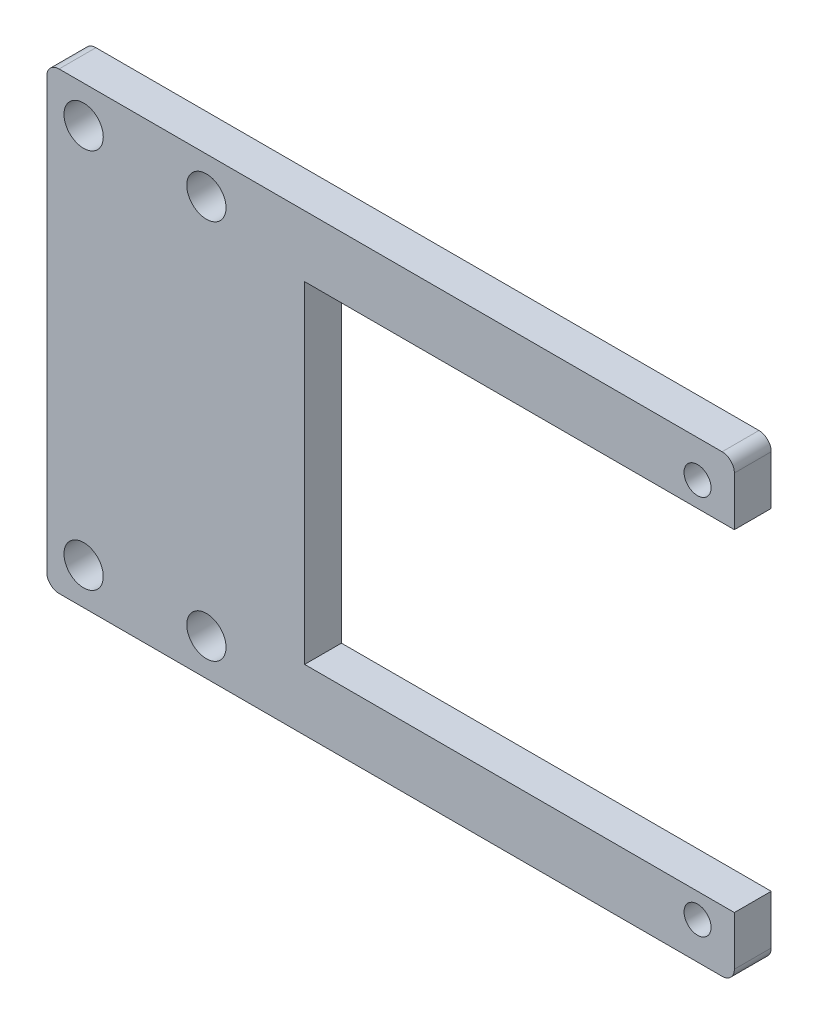
ISO-10303-21;
HEADER;
FILE_DESCRIPTION(('STEP AP214'),'2;1');
FILE_NAME('part.step','',(''),(''),'','','');
FILE_SCHEMA(('AUTOMOTIVE_DESIGN { 1 0 10303 214 1 1 1 1 }'));
ENDSEC;
DATA;
#1=APPLICATION_CONTEXT('core data for automotive mechanical design processes');
#2=APPLICATION_PROTOCOL_DEFINITION('international standard','automotive_design',2000,#1);
#3=PRODUCT_CONTEXT('',#1,'mechanical');
#4=PRODUCT('Part','Part','',(#3));
#5=PRODUCT_RELATED_PRODUCT_CATEGORY('part','',(#4));
#6=PRODUCT_DEFINITION_FORMATION('','',#4);
#7=PRODUCT_DEFINITION_CONTEXT('part definition',#1,'design');
#8=PRODUCT_DEFINITION('design','',#6,#7);
#9=PRODUCT_DEFINITION_SHAPE('','',#8);
#10=(LENGTH_UNIT() NAMED_UNIT(*) SI_UNIT(.MILLI.,.METRE.));
#11=(NAMED_UNIT(*) PLANE_ANGLE_UNIT() SI_UNIT($,.RADIAN.));
#12=(NAMED_UNIT(*) SI_UNIT($,.STERADIAN.) SOLID_ANGLE_UNIT());
#13=UNCERTAINTY_MEASURE_WITH_UNIT(LENGTH_MEASURE(1.E-05),#10,'distance_accuracy_value','');
#14=(GEOMETRIC_REPRESENTATION_CONTEXT(3) GLOBAL_UNCERTAINTY_ASSIGNED_CONTEXT((#13)) GLOBAL_UNIT_ASSIGNED_CONTEXT((#10,
#11,#12)) REPRESENTATION_CONTEXT('',''));
#15=CARTESIAN_POINT('',(0.,0.,0.));
#16=DIRECTION('',(0.,0.,1.));
#17=DIRECTION('',(1.,0.,0.));
#18=AXIS2_PLACEMENT_3D('',#15,#16,#17);
#19=CARTESIAN_POINT('',(0.,0.,3.));
#20=DIRECTION('',(0.,0.,-1.));
#21=DIRECTION('',(-1.,0.,0.));
#22=AXIS2_PLACEMENT_3D('',#19,#20,#21);
#23=PLANE('',#22);
#24=DIRECTION('',(0.,-1.,0.));
#25=VECTOR('',#24,1.);
#26=CARTESIAN_POINT('',(-28.,-18.5,3.));
#27=LINE('',#26,#25);
#28=CARTESIAN_POINT('',(-28.,17.5,3.));
#29=VERTEX_POINT('',#28);
#30=CARTESIAN_POINT('',(-28.,-17.5,3.));
#31=VERTEX_POINT('',#30);
#32=EDGE_CURVE('E237',#29,#31,#27,.T.);
#33=ORIENTED_EDGE('',*,*,#32,.T.);
#34=CARTESIAN_POINT('',(-27.,-17.5,3.));
#35=DIRECTION('',(0.,0.,-1.));
#36=DIRECTION('',(-1.,0.,0.));
#37=AXIS2_PLACEMENT_3D('',#34,#35,#36);
#38=CIRCLE('',#37,1.);
#39=CARTESIAN_POINT('',(-27.,-18.5,3.));
#40=VERTEX_POINT('',#39);
#41=EDGE_CURVE('E209',#31,#40,#38,.F.);
#42=ORIENTED_EDGE('',*,*,#41,.T.);
#43=DIRECTION('',(1.,0.,0.));
#44=VECTOR('',#43,1.);
#45=CARTESIAN_POINT('',(-28.,-18.5,3.));
#46=LINE('',#45,#44);
#47=CARTESIAN_POINT('',(27.,-18.5,3.));
#48=VERTEX_POINT('',#47);
#49=EDGE_CURVE('E136',#40,#48,#46,.T.);
#50=ORIENTED_EDGE('',*,*,#49,.T.);
#51=CARTESIAN_POINT('',(27.,-17.5,3.));
#52=DIRECTION('',(0.,0.,-1.));
#53=DIRECTION('',(-1.,0.,0.));
#54=AXIS2_PLACEMENT_3D('',#51,#52,#53);
#55=CIRCLE('',#54,1.);
#56=CARTESIAN_POINT('',(28.,-17.5,3.));
#57=VERTEX_POINT('',#56);
#58=EDGE_CURVE('E60',#48,#57,#55,.F.);
#59=ORIENTED_EDGE('',*,*,#58,.T.);
#60=DIRECTION('',(0.,1.,0.));
#61=VECTOR('',#60,1.);
#62=CARTESIAN_POINT('',(28.,-13.5,3.));
#63=LINE('',#62,#61);
#64=CARTESIAN_POINT('',(28.,-13.5,3.));
#65=VERTEX_POINT('',#64);
#66=EDGE_CURVE('E126',#57,#65,#63,.T.);
#67=ORIENTED_EDGE('',*,*,#66,.T.);
#68=DIRECTION('',(-1.,0.,0.));
#69=VECTOR('',#68,1.);
#70=CARTESIAN_POINT('',(-7.,-13.5,3.));
#71=LINE('',#70,#69);
#72=CARTESIAN_POINT('',(-7.,-13.5,3.));
#73=VERTEX_POINT('',#72);
#74=EDGE_CURVE('E131',#65,#73,#71,.T.);
#75=ORIENTED_EDGE('',*,*,#74,.T.);
#76=DIRECTION('',(0.,1.,0.));
#77=VECTOR('',#76,1.);
#78=CARTESIAN_POINT('',(-7.,13.5,3.));
#79=LINE('',#78,#77);
#80=CARTESIAN_POINT('',(-7.,13.5,3.));
#81=VERTEX_POINT('',#80);
#82=EDGE_CURVE('E151',#73,#81,#79,.T.);
#83=ORIENTED_EDGE('',*,*,#82,.T.);
#84=DIRECTION('',(1.,0.,0.));
#85=VECTOR('',#84,1.);
#86=CARTESIAN_POINT('',(28.,13.5,3.));
#87=LINE('',#86,#85);
#88=CARTESIAN_POINT('',(28.,13.5,3.));
#89=VERTEX_POINT('',#88);
#90=EDGE_CURVE('E153',#81,#89,#87,.T.);
#91=ORIENTED_EDGE('',*,*,#90,.T.);
#92=DIRECTION('',(0.,1.,0.));
#93=VECTOR('',#92,1.);
#94=CARTESIAN_POINT('',(28.,18.5,3.));
#95=LINE('',#94,#93);
#96=CARTESIAN_POINT('',(28.,17.5,3.));
#97=VERTEX_POINT('',#96);
#98=EDGE_CURVE('E158',#89,#97,#95,.T.);
#99=ORIENTED_EDGE('',*,*,#98,.T.);
#100=CARTESIAN_POINT('',(27.,17.5,3.));
#101=DIRECTION('',(0.,0.,-1.));
#102=DIRECTION('',(-1.,0.,0.));
#103=AXIS2_PLACEMENT_3D('',#100,#101,#102);
#104=CIRCLE('',#103,1.);
#105=CARTESIAN_POINT('',(27.,18.5,3.));
#106=VERTEX_POINT('',#105);
#107=EDGE_CURVE('E206',#97,#106,#104,.F.);
#108=ORIENTED_EDGE('',*,*,#107,.T.);
#109=DIRECTION('',(-1.,0.,0.));
#110=VECTOR('',#109,1.);
#111=CARTESIAN_POINT('',(-28.,18.5,3.));
#112=LINE('',#111,#110);
#113=CARTESIAN_POINT('',(-27.,18.5,3.));
#114=VERTEX_POINT('',#113);
#115=EDGE_CURVE('E180',#106,#114,#112,.T.);
#116=ORIENTED_EDGE('',*,*,#115,.T.);
#117=CARTESIAN_POINT('',(-27.,17.5,3.));
#118=DIRECTION('',(0.,0.,-1.));
#119=DIRECTION('',(-1.,0.,0.));
#120=AXIS2_PLACEMENT_3D('',#117,#118,#119);
#121=CIRCLE('',#120,1.);
#122=EDGE_CURVE('E204',#114,#29,#121,.F.);
#123=ORIENTED_EDGE('',*,*,#122,.T.);
#124=EDGE_LOOP('',(#33,#42,#50,#59,#67,#75,#83,#91,#99,#108,#116,#123));
#125=FACE_BOUND('',#124,.T.);
#126=CARTESIAN_POINT('',(25.,15.5,3.));
#127=DIRECTION('',(0.,0.,1.));
#128=DIRECTION('',(1.,0.,0.));
#129=AXIS2_PLACEMENT_3D('',#126,#127,#128);
#130=CIRCLE('',#129,1.1);
#131=CARTESIAN_POINT('',(26.1,15.5,3.));
#132=VERTEX_POINT('',#131);
#133=EDGE_CURVE('E165',#132,#132,#130,.T.);
#134=ORIENTED_EDGE('',*,*,#133,.F.);
#135=EDGE_LOOP('',(#134));
#136=FACE_BOUND('',#135,.T.);
#137=CARTESIAN_POINT('',(24.9999999999999,-15.5,3.));
#138=DIRECTION('',(0.,0.,1.));
#139=DIRECTION('',(-1.,0.,0.));
#140=AXIS2_PLACEMENT_3D('',#137,#138,#139);
#141=CIRCLE('',#140,1.1);
#142=CARTESIAN_POINT('',(23.8999999999999,-15.5,3.));
#143=VERTEX_POINT('',#142);
#144=EDGE_CURVE('E245',#143,#143,#141,.T.);
#145=ORIENTED_EDGE('',*,*,#144,.F.);
#146=EDGE_LOOP('',(#145));
#147=FACE_BOUND('',#146,.T.);
#148=CARTESIAN_POINT('',(-25.,15.5,3.));
#149=DIRECTION('',(0.,0.,1.));
#150=DIRECTION('',(1.,0.,0.));
#151=AXIS2_PLACEMENT_3D('',#148,#149,#150);
#152=CIRCLE('',#151,1.6);
#153=CARTESIAN_POINT('',(-23.4,15.5,3.));
#154=VERTEX_POINT('',#153);
#155=EDGE_CURVE('E251',#154,#154,#152,.T.);
#156=ORIENTED_EDGE('',*,*,#155,.F.);
#157=EDGE_LOOP('',(#156));
#158=FACE_BOUND('',#157,.T.);
#159=CARTESIAN_POINT('',(-15.,15.5,3.));
#160=DIRECTION('',(0.,0.,1.));
#161=DIRECTION('',(1.,0.,0.));
#162=AXIS2_PLACEMENT_3D('',#159,#160,#161);
#163=CIRCLE('',#162,1.6);
#164=CARTESIAN_POINT('',(-13.4,15.5,3.));
#165=VERTEX_POINT('',#164);
#166=EDGE_CURVE('E257',#165,#165,#163,.T.);
#167=ORIENTED_EDGE('',*,*,#166,.F.);
#168=EDGE_LOOP('',(#167));
#169=FACE_BOUND('',#168,.T.);
#170=CARTESIAN_POINT('',(-15.,-15.5,3.));
#171=DIRECTION('',(0.,0.,1.));
#172=DIRECTION('',(-1.,0.,0.));
#173=AXIS2_PLACEMENT_3D('',#170,#171,#172);
#174=CIRCLE('',#173,1.6);
#175=CARTESIAN_POINT('',(-16.6,-15.5,3.));
#176=VERTEX_POINT('',#175);
#177=EDGE_CURVE('E263',#176,#176,#174,.T.);
#178=ORIENTED_EDGE('',*,*,#177,.F.);
#179=EDGE_LOOP('',(#178));
#180=FACE_BOUND('',#179,.T.);
#181=CARTESIAN_POINT('',(-25.,-15.5,3.));
#182=DIRECTION('',(0.,0.,1.));
#183=DIRECTION('',(-1.,0.,0.));
#184=AXIS2_PLACEMENT_3D('',#181,#182,#183);
#185=CIRCLE('',#184,1.6);
#186=CARTESIAN_POINT('',(-26.6,-15.5,3.));
#187=VERTEX_POINT('',#186);
#188=EDGE_CURVE('E269',#187,#187,#185,.T.);
#189=ORIENTED_EDGE('',*,*,#188,.F.);
#190=EDGE_LOOP('',(#189));
#191=FACE_BOUND('',#190,.T.);
#192=ADVANCED_FACE('F39',(#125,#136,#147,#158,#169,#180,#191),#23,.F.);
#193=CARTESIAN_POINT('',(0.,0.,0.));
#194=DIRECTION('',(0.,0.,-1.));
#195=DIRECTION('',(-1.,0.,0.));
#196=AXIS2_PLACEMENT_3D('',#193,#194,#195);
#197=PLANE('',#196);
#198=CARTESIAN_POINT('',(-15.,-15.5,0.));
#199=DIRECTION('',(0.,0.,1.));
#200=DIRECTION('',(-1.,0.,0.));
#201=AXIS2_PLACEMENT_3D('',#198,#199,#200);
#202=CIRCLE('',#201,1.6);
#203=CARTESIAN_POINT('',(-16.6,-15.5,0.));
#204=VERTEX_POINT('',#203);
#205=EDGE_CURVE('E266',#204,#204,#202,.T.);
#206=ORIENTED_EDGE('',*,*,#205,.T.);
#207=EDGE_LOOP('',(#206));
#208=FACE_BOUND('',#207,.T.);
#209=CARTESIAN_POINT('',(-25.,15.5,0.));
#210=DIRECTION('',(0.,0.,1.));
#211=DIRECTION('',(1.,0.,0.));
#212=AXIS2_PLACEMENT_3D('',#209,#210,#211);
#213=CIRCLE('',#212,1.6);
#214=CARTESIAN_POINT('',(-23.4,15.5,0.));
#215=VERTEX_POINT('',#214);
#216=EDGE_CURVE('E254',#215,#215,#213,.T.);
#217=ORIENTED_EDGE('',*,*,#216,.T.);
#218=EDGE_LOOP('',(#217));
#219=FACE_BOUND('',#218,.T.);
#220=CARTESIAN_POINT('',(25.,15.5,0.));
#221=DIRECTION('',(0.,0.,1.));
#222=DIRECTION('',(1.,0.,0.));
#223=AXIS2_PLACEMENT_3D('',#220,#221,#222);
#224=CIRCLE('',#223,1.1);
#225=CARTESIAN_POINT('',(26.1,15.5,0.));
#226=VERTEX_POINT('',#225);
#227=EDGE_CURVE('E242',#226,#226,#224,.T.);
#228=ORIENTED_EDGE('',*,*,#227,.T.);
#229=EDGE_LOOP('',(#228));
#230=FACE_BOUND('',#229,.T.);
#231=DIRECTION('',(1.,0.,0.));
#232=VECTOR('',#231,1.);
#233=CARTESIAN_POINT('',(-28.,-18.5,0.));
#234=LINE('',#233,#232);
#235=CARTESIAN_POINT('',(-27.,-18.5,0.));
#236=VERTEX_POINT('',#235);
#237=CARTESIAN_POINT('',(27.,-18.5,0.));
#238=VERTEX_POINT('',#237);
#239=EDGE_CURVE('E168',#236,#238,#234,.T.);
#240=ORIENTED_EDGE('',*,*,#239,.F.);
#241=CARTESIAN_POINT('',(-27.,-17.5,0.));
#242=DIRECTION('',(0.,0.,-1.));
#243=DIRECTION('',(-1.,0.,0.));
#244=AXIS2_PLACEMENT_3D('',#241,#242,#243);
#245=CIRCLE('',#244,1.);
#246=CARTESIAN_POINT('',(-28.,-17.5,0.));
#247=VERTEX_POINT('',#246);
#248=EDGE_CURVE('E197',#236,#247,#245,.T.);
#249=ORIENTED_EDGE('',*,*,#248,.T.);
#250=DIRECTION('',(0.,-1.,0.));
#251=VECTOR('',#250,1.);
#252=CARTESIAN_POINT('',(-28.,-18.5,0.));
#253=LINE('',#252,#251);
#254=CARTESIAN_POINT('',(-28.,17.5,0.));
#255=VERTEX_POINT('',#254);
#256=EDGE_CURVE('E164',#255,#247,#253,.T.);
#257=ORIENTED_EDGE('',*,*,#256,.F.);
#258=CARTESIAN_POINT('',(-27.,17.5,0.));
#259=DIRECTION('',(0.,0.,-1.));
#260=DIRECTION('',(-1.,0.,0.));
#261=AXIS2_PLACEMENT_3D('',#258,#259,#260);
#262=CIRCLE('',#261,1.);
#263=CARTESIAN_POINT('',(-27.,18.5,0.));
#264=VERTEX_POINT('',#263);
#265=EDGE_CURVE('E191',#255,#264,#262,.T.);
#266=ORIENTED_EDGE('',*,*,#265,.T.);
#267=DIRECTION('',(-1.,0.,0.));
#268=VECTOR('',#267,1.);
#269=CARTESIAN_POINT('',(-28.,18.5,0.));
#270=LINE('',#269,#268);
#271=CARTESIAN_POINT('',(27.,18.5,0.));
#272=VERTEX_POINT('',#271);
#273=EDGE_CURVE('E161',#272,#264,#270,.T.);
#274=ORIENTED_EDGE('',*,*,#273,.F.);
#275=CARTESIAN_POINT('',(27.,17.5,0.));
#276=DIRECTION('',(0.,0.,-1.));
#277=DIRECTION('',(-1.,0.,0.));
#278=AXIS2_PLACEMENT_3D('',#275,#276,#277);
#279=CIRCLE('',#278,1.);
#280=CARTESIAN_POINT('',(28.,17.5,0.));
#281=VERTEX_POINT('',#280);
#282=EDGE_CURVE('E193',#272,#281,#279,.T.);
#283=ORIENTED_EDGE('',*,*,#282,.T.);
#284=DIRECTION('',(0.,1.,0.));
#285=VECTOR('',#284,1.);
#286=CARTESIAN_POINT('',(28.,18.5,0.));
#287=LINE('',#286,#285);
#288=CARTESIAN_POINT('',(28.,13.5,0.));
#289=VERTEX_POINT('',#288);
#290=EDGE_CURVE('E178',#289,#281,#287,.T.);
#291=ORIENTED_EDGE('',*,*,#290,.F.);
#292=DIRECTION('',(1.,0.,0.));
#293=VECTOR('',#292,1.);
#294=CARTESIAN_POINT('',(28.,13.5,0.));
#295=LINE('',#294,#293);
#296=CARTESIAN_POINT('',(-7.,13.5,0.));
#297=VERTEX_POINT('',#296);
#298=EDGE_CURVE('E176',#297,#289,#295,.T.);
#299=ORIENTED_EDGE('',*,*,#298,.F.);
#300=DIRECTION('',(0.,1.,0.));
#301=VECTOR('',#300,1.);
#302=CARTESIAN_POINT('',(-7.,13.5,0.));
#303=LINE('',#302,#301);
#304=CARTESIAN_POINT('',(-7.,-13.5,0.));
#305=VERTEX_POINT('',#304);
#306=EDGE_CURVE('E174',#305,#297,#303,.T.);
#307=ORIENTED_EDGE('',*,*,#306,.F.);
#308=DIRECTION('',(-1.,0.,0.));
#309=VECTOR('',#308,1.);
#310=CARTESIAN_POINT('',(-7.,-13.5,0.));
#311=LINE('',#310,#309);
#312=CARTESIAN_POINT('',(28.,-13.5,0.));
#313=VERTEX_POINT('',#312);
#314=EDGE_CURVE('E172',#313,#305,#311,.T.);
#315=ORIENTED_EDGE('',*,*,#314,.F.);
#316=DIRECTION('',(0.,1.,0.));
#317=VECTOR('',#316,1.);
#318=CARTESIAN_POINT('',(28.,-13.5,0.));
#319=LINE('',#318,#317);
#320=CARTESIAN_POINT('',(28.,-17.5,0.));
#321=VERTEX_POINT('',#320);
#322=EDGE_CURVE('E142',#321,#313,#319,.T.);
#323=ORIENTED_EDGE('',*,*,#322,.F.);
#324=CARTESIAN_POINT('',(27.,-17.5,0.));
#325=DIRECTION('',(0.,0.,-1.));
#326=DIRECTION('',(-1.,0.,0.));
#327=AXIS2_PLACEMENT_3D('',#324,#325,#326);
#328=CIRCLE('',#327,1.);
#329=EDGE_CURVE('E195',#321,#238,#328,.T.);
#330=ORIENTED_EDGE('',*,*,#329,.T.);
#331=EDGE_LOOP('',(#240,#249,#257,#266,#274,#283,#291,#299,#307,#315,#323,#330));
#332=FACE_BOUND('',#331,.T.);
#333=CARTESIAN_POINT('',(24.9999999999999,-15.5,0.));
#334=DIRECTION('',(0.,0.,1.));
#335=DIRECTION('',(-1.,0.,0.));
#336=AXIS2_PLACEMENT_3D('',#333,#334,#335);
#337=CIRCLE('',#336,1.1);
#338=CARTESIAN_POINT('',(23.8999999999999,-15.5,0.));
#339=VERTEX_POINT('',#338);
#340=EDGE_CURVE('E248',#339,#339,#337,.T.);
#341=ORIENTED_EDGE('',*,*,#340,.T.);
#342=EDGE_LOOP('',(#341));
#343=FACE_BOUND('',#342,.T.);
#344=CARTESIAN_POINT('',(-15.,15.5,0.));
#345=DIRECTION('',(0.,0.,1.));
#346=DIRECTION('',(1.,0.,0.));
#347=AXIS2_PLACEMENT_3D('',#344,#345,#346);
#348=CIRCLE('',#347,1.6);
#349=CARTESIAN_POINT('',(-13.4,15.5,0.));
#350=VERTEX_POINT('',#349);
#351=EDGE_CURVE('E260',#350,#350,#348,.T.);
#352=ORIENTED_EDGE('',*,*,#351,.T.);
#353=EDGE_LOOP('',(#352));
#354=FACE_BOUND('',#353,.T.);
#355=CARTESIAN_POINT('',(-25.,-15.5,0.));
#356=DIRECTION('',(0.,0.,1.));
#357=DIRECTION('',(-1.,0.,0.));
#358=AXIS2_PLACEMENT_3D('',#355,#356,#357);
#359=CIRCLE('',#358,1.6);
#360=CARTESIAN_POINT('',(-26.6,-15.5,0.));
#361=VERTEX_POINT('',#360);
#362=EDGE_CURVE('E272',#361,#361,#359,.T.);
#363=ORIENTED_EDGE('',*,*,#362,.T.);
#364=EDGE_LOOP('',(#363));
#365=FACE_BOUND('',#364,.T.);
#366=ADVANCED_FACE('F226',(#208,#219,#230,#332,#343,#354,#365),#197,.T.);
#367=CARTESIAN_POINT('',(-28.,18.5,3.));
#368=DIRECTION('',(0.,-1.,0.));
#369=DIRECTION('',(0.,0.,-1.));
#370=AXIS2_PLACEMENT_3D('',#367,#368,#369);
#371=PLANE('',#370);
#372=ORIENTED_EDGE('',*,*,#115,.F.);
#373=DIRECTION('',(0.,0.,-1.));
#374=VECTOR('',#373,1.);
#375=CARTESIAN_POINT('',(27.,18.5,3.));
#376=LINE('',#375,#374);
#377=EDGE_CURVE('E47',#106,#272,#376,.T.);
#378=ORIENTED_EDGE('',*,*,#377,.T.);
#379=ORIENTED_EDGE('',*,*,#273,.T.);
#380=DIRECTION('',(0.,0.,-1.));
#381=VECTOR('',#380,1.);
#382=CARTESIAN_POINT('',(-27.,18.5,3.));
#383=LINE('',#382,#381);
#384=EDGE_CURVE('E213',#264,#114,#383,.F.);
#385=ORIENTED_EDGE('',*,*,#384,.T.);
#386=EDGE_LOOP('',(#372,#378,#379,#385));
#387=FACE_BOUND('',#386,.T.);
#388=ADVANCED_FACE('F219',(#387),#371,.F.);
#389=CARTESIAN_POINT('',(-28.,-18.5,3.));
#390=DIRECTION('',(1.,0.,0.));
#391=DIRECTION('',(0.,0.,-1.));
#392=AXIS2_PLACEMENT_3D('',#389,#390,#391);
#393=PLANE('',#392);
#394=ORIENTED_EDGE('',*,*,#256,.T.);
#395=DIRECTION('',(0.,0.,-1.));
#396=VECTOR('',#395,1.);
#397=CARTESIAN_POINT('',(-28.,-17.5,3.));
#398=LINE('',#397,#396);
#399=EDGE_CURVE('E202',#247,#31,#398,.F.);
#400=ORIENTED_EDGE('',*,*,#399,.T.);
#401=ORIENTED_EDGE('',*,*,#32,.F.);
#402=DIRECTION('',(0.,0.,-1.));
#403=VECTOR('',#402,1.);
#404=CARTESIAN_POINT('',(-28.,17.5,3.));
#405=LINE('',#404,#403);
#406=EDGE_CURVE('E199',#29,#255,#405,.T.);
#407=ORIENTED_EDGE('',*,*,#406,.T.);
#408=EDGE_LOOP('',(#394,#400,#401,#407));
#409=FACE_BOUND('',#408,.T.);
#410=ADVANCED_FACE('F235',(#409),#393,.F.);
#411=CARTESIAN_POINT('',(-28.,-18.5,3.));
#412=DIRECTION('',(0.,1.,0.));
#413=DIRECTION('',(0.,0.,1.));
#414=AXIS2_PLACEMENT_3D('',#411,#412,#413);
#415=PLANE('',#414);
#416=ORIENTED_EDGE('',*,*,#49,.F.);
#417=DIRECTION('',(0.,0.,-1.));
#418=VECTOR('',#417,1.);
#419=CARTESIAN_POINT('',(-27.,-18.5,3.));
#420=LINE('',#419,#418);
#421=EDGE_CURVE('E188',#40,#236,#420,.T.);
#422=ORIENTED_EDGE('',*,*,#421,.T.);
#423=ORIENTED_EDGE('',*,*,#239,.T.);
#424=DIRECTION('',(0.,0.,-1.));
#425=VECTOR('',#424,1.);
#426=CARTESIAN_POINT('',(27.,-18.5,3.));
#427=LINE('',#426,#425);
#428=EDGE_CURVE('E145',#238,#48,#427,.F.);
#429=ORIENTED_EDGE('',*,*,#428,.T.);
#430=EDGE_LOOP('',(#416,#422,#423,#429));
#431=FACE_BOUND('',#430,.T.);
#432=ADVANCED_FACE('F307',(#431),#415,.F.);
#433=CARTESIAN_POINT('',(28.,-13.5,3.));
#434=DIRECTION('',(-1.,0.,0.));
#435=DIRECTION('',(0.,-1.,0.));
#436=AXIS2_PLACEMENT_3D('',#433,#434,#435);
#437=PLANE('',#436);
#438=ORIENTED_EDGE('',*,*,#66,.F.);
#439=DIRECTION('',(0.,0.,-1.));
#440=VECTOR('',#439,1.);
#441=CARTESIAN_POINT('',(28.,-17.5,3.));
#442=LINE('',#441,#440);
#443=EDGE_CURVE('E211',#57,#321,#442,.T.);
#444=ORIENTED_EDGE('',*,*,#443,.T.);
#445=ORIENTED_EDGE('',*,*,#322,.T.);
#446=DIRECTION('',(0.,0.,-1.));
#447=VECTOR('',#446,1.);
#448=CARTESIAN_POINT('',(28.,-13.5,3.));
#449=LINE('',#448,#447);
#450=EDGE_CURVE('E139',#65,#313,#449,.T.);
#451=ORIENTED_EDGE('',*,*,#450,.F.);
#452=EDGE_LOOP('',(#438,#444,#445,#451));
#453=FACE_BOUND('',#452,.T.);
#454=ADVANCED_FACE('F140',(#453),#437,.F.);
#455=CARTESIAN_POINT('',(-7.,-13.5,3.));
#456=DIRECTION('',(0.,-1.,0.));
#457=DIRECTION('',(0.,0.,-1.));
#458=AXIS2_PLACEMENT_3D('',#455,#456,#457);
#459=PLANE('',#458);
#460=ORIENTED_EDGE('',*,*,#314,.T.);
#461=DIRECTION('',(0.,0.,-1.));
#462=VECTOR('',#461,1.);
#463=CARTESIAN_POINT('',(-7.,-13.5,3.));
#464=LINE('',#463,#462);
#465=EDGE_CURVE('E146',#73,#305,#464,.T.);
#466=ORIENTED_EDGE('',*,*,#465,.F.);
#467=ORIENTED_EDGE('',*,*,#74,.F.);
#468=ORIENTED_EDGE('',*,*,#450,.T.);
#469=EDGE_LOOP('',(#460,#466,#467,#468));
#470=FACE_BOUND('',#469,.T.);
#471=ADVANCED_FACE('F148',(#470),#459,.F.);
#472=CARTESIAN_POINT('',(-7.,13.5,3.));
#473=DIRECTION('',(-1.,0.,0.));
#474=DIRECTION('',(0.,-1.,0.));
#475=AXIS2_PLACEMENT_3D('',#472,#473,#474);
#476=PLANE('',#475);
#477=ORIENTED_EDGE('',*,*,#306,.T.);
#478=DIRECTION('',(0.,0.,-1.));
#479=VECTOR('',#478,1.);
#480=CARTESIAN_POINT('',(-7.,13.5,3.));
#481=LINE('',#480,#479);
#482=EDGE_CURVE('E183',#81,#297,#481,.T.);
#483=ORIENTED_EDGE('',*,*,#482,.F.);
#484=ORIENTED_EDGE('',*,*,#82,.F.);
#485=ORIENTED_EDGE('',*,*,#465,.T.);
#486=EDGE_LOOP('',(#477,#483,#484,#485));
#487=FACE_BOUND('',#486,.T.);
#488=ADVANCED_FACE('F298',(#487),#476,.F.);
#489=CARTESIAN_POINT('',(28.,13.5,3.));
#490=DIRECTION('',(0.,1.,0.));
#491=DIRECTION('',(-1.,0.,0.));
#492=AXIS2_PLACEMENT_3D('',#489,#490,#491);
#493=PLANE('',#492);
#494=ORIENTED_EDGE('',*,*,#298,.T.);
#495=DIRECTION('',(0.,0.,-1.));
#496=VECTOR('',#495,1.);
#497=CARTESIAN_POINT('',(28.,13.5,3.));
#498=LINE('',#497,#496);
#499=EDGE_CURVE('E160',#89,#289,#498,.T.);
#500=ORIENTED_EDGE('',*,*,#499,.F.);
#501=ORIENTED_EDGE('',*,*,#90,.F.);
#502=ORIENTED_EDGE('',*,*,#482,.T.);
#503=EDGE_LOOP('',(#494,#500,#501,#502));
#504=FACE_BOUND('',#503,.T.);
#505=ADVANCED_FACE('F295',(#504),#493,.F.);
#506=CARTESIAN_POINT('',(28.,18.5,3.));
#507=DIRECTION('',(-1.,0.,0.));
#508=DIRECTION('',(0.,0.,1.));
#509=AXIS2_PLACEMENT_3D('',#506,#507,#508);
#510=PLANE('',#509);
#511=ORIENTED_EDGE('',*,*,#290,.T.);
#512=DIRECTION('',(0.,0.,-1.));
#513=VECTOR('',#512,1.);
#514=CARTESIAN_POINT('',(28.,17.5,3.));
#515=LINE('',#514,#513);
#516=EDGE_CURVE('E11',#281,#97,#515,.F.);
#517=ORIENTED_EDGE('',*,*,#516,.T.);
#518=ORIENTED_EDGE('',*,*,#98,.F.);
#519=ORIENTED_EDGE('',*,*,#499,.T.);
#520=EDGE_LOOP('',(#511,#517,#518,#519));
#521=FACE_BOUND('',#520,.T.);
#522=ADVANCED_FACE('F292',(#521),#510,.F.);
#523=CARTESIAN_POINT('',(25.,15.5,3.));
#524=DIRECTION('',(0.,0.,-1.));
#525=DIRECTION('',(-1.,0.,0.));
#526=AXIS2_PLACEMENT_3D('',#523,#524,#525);
#527=CYLINDRICAL_SURFACE('',#526,1.1);
#528=ORIENTED_EDGE('',*,*,#133,.T.);
#529=EDGE_LOOP('',(#528));
#530=FACE_BOUND('',#529,.T.);
#531=ORIENTED_EDGE('',*,*,#227,.F.);
#532=EDGE_LOOP('',(#531));
#533=FACE_BOUND('',#532,.T.);
#534=ADVANCED_FACE('F289',(#530,#533),#527,.F.);
#535=CARTESIAN_POINT('',(24.9999999999999,-15.5,3.));
#536=DIRECTION('',(0.,0.,-1.));
#537=DIRECTION('',(-1.,0.,0.));
#538=AXIS2_PLACEMENT_3D('',#535,#536,#537);
#539=CYLINDRICAL_SURFACE('',#538,1.1);
#540=ORIENTED_EDGE('',*,*,#144,.T.);
#541=EDGE_LOOP('',(#540));
#542=FACE_BOUND('',#541,.T.);
#543=ORIENTED_EDGE('',*,*,#340,.F.);
#544=EDGE_LOOP('',(#543));
#545=FACE_BOUND('',#544,.T.);
#546=ADVANCED_FACE('F449',(#542,#545),#539,.F.);
#547=CARTESIAN_POINT('',(-25.,15.5,3.));
#548=DIRECTION('',(0.,0.,-1.));
#549=DIRECTION('',(-1.,0.,0.));
#550=AXIS2_PLACEMENT_3D('',#547,#548,#549);
#551=CYLINDRICAL_SURFACE('',#550,1.6);
#552=ORIENTED_EDGE('',*,*,#155,.T.);
#553=EDGE_LOOP('',(#552));
#554=FACE_BOUND('',#553,.T.);
#555=ORIENTED_EDGE('',*,*,#216,.F.);
#556=EDGE_LOOP('',(#555));
#557=FACE_BOUND('',#556,.T.);
#558=ADVANCED_FACE('F438',(#554,#557),#551,.F.);
#559=CARTESIAN_POINT('',(-15.,15.5,3.));
#560=DIRECTION('',(0.,0.,-1.));
#561=DIRECTION('',(-1.,0.,0.));
#562=AXIS2_PLACEMENT_3D('',#559,#560,#561);
#563=CYLINDRICAL_SURFACE('',#562,1.6);
#564=ORIENTED_EDGE('',*,*,#166,.T.);
#565=EDGE_LOOP('',(#564));
#566=FACE_BOUND('',#565,.T.);
#567=ORIENTED_EDGE('',*,*,#351,.F.);
#568=EDGE_LOOP('',(#567));
#569=FACE_BOUND('',#568,.T.);
#570=ADVANCED_FACE('F427',(#566,#569),#563,.F.);
#571=CARTESIAN_POINT('',(-15.,-15.5,3.));
#572=DIRECTION('',(0.,0.,-1.));
#573=DIRECTION('',(-1.,0.,0.));
#574=AXIS2_PLACEMENT_3D('',#571,#572,#573);
#575=CYLINDRICAL_SURFACE('',#574,1.6);
#576=ORIENTED_EDGE('',*,*,#177,.T.);
#577=EDGE_LOOP('',(#576));
#578=FACE_BOUND('',#577,.T.);
#579=ORIENTED_EDGE('',*,*,#205,.F.);
#580=EDGE_LOOP('',(#579));
#581=FACE_BOUND('',#580,.T.);
#582=ADVANCED_FACE('F417',(#578,#581),#575,.F.);
#583=CARTESIAN_POINT('',(-25.,-15.5,3.));
#584=DIRECTION('',(0.,0.,-1.));
#585=DIRECTION('',(-1.,0.,0.));
#586=AXIS2_PLACEMENT_3D('',#583,#584,#585);
#587=CYLINDRICAL_SURFACE('',#586,1.6);
#588=ORIENTED_EDGE('',*,*,#188,.T.);
#589=EDGE_LOOP('',(#588));
#590=FACE_BOUND('',#589,.T.);
#591=ORIENTED_EDGE('',*,*,#362,.F.);
#592=EDGE_LOOP('',(#591));
#593=FACE_BOUND('',#592,.T.);
#594=ADVANCED_FACE('F278',(#590,#593),#587,.F.);
#595=CARTESIAN_POINT('',(-27.,-17.5,3.));
#596=DIRECTION('',(0.,0.,-1.));
#597=DIRECTION('',(-1.,0.,0.));
#598=AXIS2_PLACEMENT_3D('',#595,#596,#597);
#599=CYLINDRICAL_SURFACE('',#598,1.);
#600=ORIENTED_EDGE('',*,*,#41,.F.);
#601=ORIENTED_EDGE('',*,*,#399,.F.);
#602=ORIENTED_EDGE('',*,*,#248,.F.);
#603=ORIENTED_EDGE('',*,*,#421,.F.);
#604=EDGE_LOOP('',(#600,#601,#602,#603));
#605=FACE_BOUND('',#604,.T.);
#606=ADVANCED_FACE('F315',(#605),#599,.T.);
#607=CARTESIAN_POINT('',(27.,-17.5,3.));
#608=DIRECTION('',(0.,0.,-1.));
#609=DIRECTION('',(-1.,0.,0.));
#610=AXIS2_PLACEMENT_3D('',#607,#608,#609);
#611=CYLINDRICAL_SURFACE('',#610,1.);
#612=ORIENTED_EDGE('',*,*,#58,.F.);
#613=ORIENTED_EDGE('',*,*,#428,.F.);
#614=ORIENTED_EDGE('',*,*,#329,.F.);
#615=ORIENTED_EDGE('',*,*,#443,.F.);
#616=EDGE_LOOP('',(#612,#613,#614,#615));
#617=FACE_BOUND('',#616,.T.);
#618=ADVANCED_FACE('F318',(#617),#611,.T.);
#619=CARTESIAN_POINT('',(27.,17.5,3.));
#620=DIRECTION('',(0.,0.,-1.));
#621=DIRECTION('',(-1.,0.,0.));
#622=AXIS2_PLACEMENT_3D('',#619,#620,#621);
#623=CYLINDRICAL_SURFACE('',#622,1.);
#624=ORIENTED_EDGE('',*,*,#107,.F.);
#625=ORIENTED_EDGE('',*,*,#516,.F.);
#626=ORIENTED_EDGE('',*,*,#282,.F.);
#627=ORIENTED_EDGE('',*,*,#377,.F.);
#628=EDGE_LOOP('',(#624,#625,#626,#627));
#629=FACE_BOUND('',#628,.T.);
#630=ADVANCED_FACE('F321',(#629),#623,.T.);
#631=CARTESIAN_POINT('',(-27.,17.5,3.));
#632=DIRECTION('',(0.,0.,-1.));
#633=DIRECTION('',(-1.,0.,0.));
#634=AXIS2_PLACEMENT_3D('',#631,#632,#633);
#635=CYLINDRICAL_SURFACE('',#634,1.);
#636=ORIENTED_EDGE('',*,*,#122,.F.);
#637=ORIENTED_EDGE('',*,*,#384,.F.);
#638=ORIENTED_EDGE('',*,*,#265,.F.);
#639=ORIENTED_EDGE('',*,*,#406,.F.);
#640=EDGE_LOOP('',(#636,#637,#638,#639));
#641=FACE_BOUND('',#640,.T.);
#642=ADVANCED_FACE('F41',(#641),#635,.T.);
#643=CLOSED_SHELL('',(#192,#366,#388,#410,#432,#454,#471,#488,#505,#522,#534,#546,#558,#570,
#582,#594,#606,#618,#630,#642));
#644=MANIFOLD_SOLID_BREP('B2',#643);
#645=ADVANCED_BREP_SHAPE_REPRESENTATION('',(#18,#644),#14);
#646=SHAPE_DEFINITION_REPRESENTATION(#9,#645);
ENDSEC;
END-ISO-10303-21;
